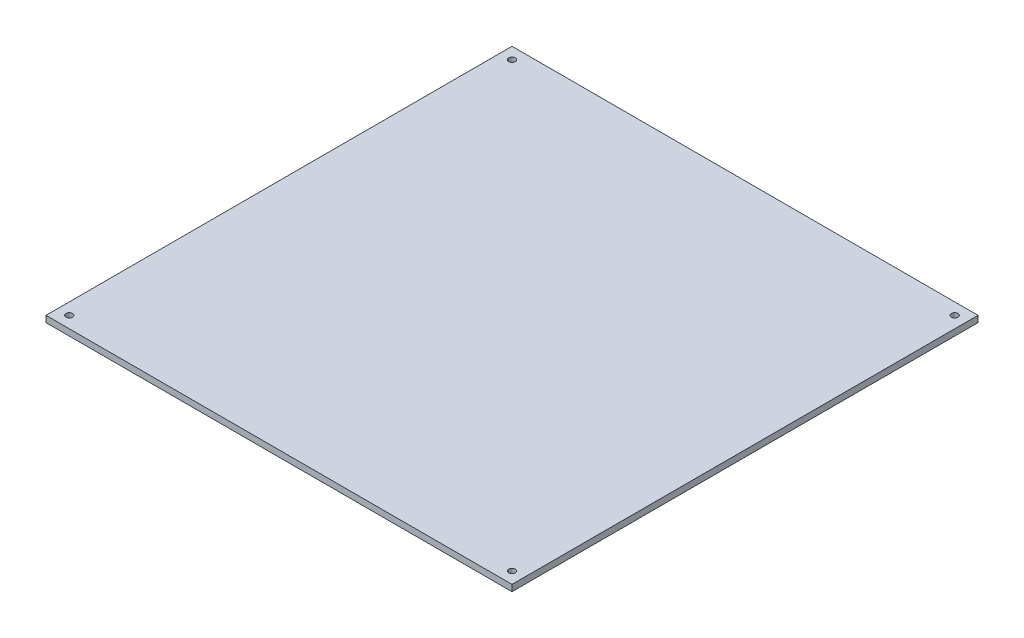
ISO-10303-21;
HEADER;
FILE_DESCRIPTION(('STEP AP214'),'2;1');
FILE_NAME('part.step','',(''),(''),'','','');
FILE_SCHEMA(('AUTOMOTIVE_DESIGN { 1 0 10303 214 1 1 1 1 }'));
ENDSEC;
DATA;
#1=APPLICATION_CONTEXT('core data for automotive mechanical design processes');
#2=APPLICATION_PROTOCOL_DEFINITION('international standard','automotive_design',2000,#1);
#3=PRODUCT_CONTEXT('',#1,'mechanical');
#4=PRODUCT('Part','Part','',(#3));
#5=PRODUCT_RELATED_PRODUCT_CATEGORY('part','',(#4));
#6=PRODUCT_DEFINITION_FORMATION('','',#4);
#7=PRODUCT_DEFINITION_CONTEXT('part definition',#1,'design');
#8=PRODUCT_DEFINITION('design','',#6,#7);
#9=PRODUCT_DEFINITION_SHAPE('','',#8);
#10=(LENGTH_UNIT() NAMED_UNIT(*) SI_UNIT(.MILLI.,.METRE.));
#11=(NAMED_UNIT(*) PLANE_ANGLE_UNIT() SI_UNIT($,.RADIAN.));
#12=(NAMED_UNIT(*) SI_UNIT($,.STERADIAN.) SOLID_ANGLE_UNIT());
#13=UNCERTAINTY_MEASURE_WITH_UNIT(LENGTH_MEASURE(1.E-05),#10,'distance_accuracy_value','');
#14=(GEOMETRIC_REPRESENTATION_CONTEXT(3) GLOBAL_UNCERTAINTY_ASSIGNED_CONTEXT((#13)) GLOBAL_UNIT_ASSIGNED_CONTEXT((#10,
#11,#12)) REPRESENTATION_CONTEXT('',''));
#15=CARTESIAN_POINT('',(0.,0.,0.));
#16=DIRECTION('',(0.,0.,1.));
#17=DIRECTION('',(1.,0.,0.));
#18=AXIS2_PLACEMENT_3D('',#15,#16,#17);
#19=CARTESIAN_POINT('',(0.,3.,0.));
#20=DIRECTION('',(0.,-1.,0.));
#21=DIRECTION('',(0.,0.,-1.));
#22=AXIS2_PLACEMENT_3D('',#19,#20,#21);
#23=PLANE('',#22);
#24=DIRECTION('',(0.,0.,1.));
#25=VECTOR('',#24,1.);
#26=CARTESIAN_POINT('',(0.,3.,0.));
#27=LINE('',#26,#25);
#28=CARTESIAN_POINT('',(0.,3.,-220.));
#29=VERTEX_POINT('',#28);
#30=CARTESIAN_POINT('',(0.,3.,0.));
#31=VERTEX_POINT('',#30);
#32=EDGE_CURVE('E85',#29,#31,#27,.T.);
#33=ORIENTED_EDGE('',*,*,#32,.T.);
#34=DIRECTION('',(1.,0.,0.));
#35=VECTOR('',#34,1.);
#36=CARTESIAN_POINT('',(0.,3.,0.));
#37=LINE('',#36,#35);
#38=CARTESIAN_POINT('',(220.,3.,0.));
#39=VERTEX_POINT('',#38);
#40=EDGE_CURVE('E80',#31,#39,#37,.T.);
#41=ORIENTED_EDGE('',*,*,#40,.T.);
#42=DIRECTION('',(0.,0.,-1.));
#43=VECTOR('',#42,1.);
#44=CARTESIAN_POINT('',(220.,3.,0.));
#45=LINE('',#44,#43);
#46=CARTESIAN_POINT('',(220.,3.,-220.));
#47=VERTEX_POINT('',#46);
#48=EDGE_CURVE('E83',#39,#47,#45,.T.);
#49=ORIENTED_EDGE('',*,*,#48,.T.);
#50=DIRECTION('',(-1.,0.,0.));
#51=VECTOR('',#50,1.);
#52=CARTESIAN_POINT('',(0.,3.,-220.));
#53=LINE('',#52,#51);
#54=EDGE_CURVE('E50',#47,#29,#53,.T.);
#55=ORIENTED_EDGE('',*,*,#54,.T.);
#56=EDGE_LOOP('',(#33,#41,#49,#55));
#57=FACE_BOUND('',#56,.T.);
#58=CARTESIAN_POINT('',(5.50000000000001,3.,-214.5));
#59=DIRECTION('',(0.,1.,0.));
#60=DIRECTION('',(0.,0.,1.));
#61=AXIS2_PLACEMENT_3D('',#58,#59,#60);
#62=CIRCLE('',#61,1.55);
#63=CARTESIAN_POINT('',(5.50000000000001,3.,-212.95));
#64=VERTEX_POINT('',#63);
#65=EDGE_CURVE('E100',#64,#64,#62,.T.);
#66=ORIENTED_EDGE('',*,*,#65,.F.);
#67=EDGE_LOOP('',(#66));
#68=FACE_BOUND('',#67,.T.);
#69=CARTESIAN_POINT('',(5.50000000000001,3.,-5.49999999999999));
#70=DIRECTION('',(0.,1.,0.));
#71=DIRECTION('',(0.,0.,1.));
#72=AXIS2_PLACEMENT_3D('',#69,#70,#71);
#73=CIRCLE('',#72,1.55);
#74=CARTESIAN_POINT('',(5.50000000000001,3.,-3.94999999999999));
#75=VERTEX_POINT('',#74);
#76=EDGE_CURVE('E115',#75,#75,#73,.T.);
#77=ORIENTED_EDGE('',*,*,#76,.F.);
#78=EDGE_LOOP('',(#77));
#79=FACE_BOUND('',#78,.T.);
#80=CARTESIAN_POINT('',(214.5,3.,-5.49999999999999));
#81=DIRECTION('',(0.,1.,0.));
#82=DIRECTION('',(0.,0.,1.));
#83=AXIS2_PLACEMENT_3D('',#80,#81,#82);
#84=CIRCLE('',#83,1.54999999999996);
#85=CARTESIAN_POINT('',(214.5,3.,-3.95000000000003));
#86=VERTEX_POINT('',#85);
#87=EDGE_CURVE('E121',#86,#86,#84,.T.);
#88=ORIENTED_EDGE('',*,*,#87,.F.);
#89=EDGE_LOOP('',(#88));
#90=FACE_BOUND('',#89,.T.);
#91=CARTESIAN_POINT('',(214.5,3.,-214.5));
#92=DIRECTION('',(0.,1.,0.));
#93=DIRECTION('',(0.,0.,1.));
#94=AXIS2_PLACEMENT_3D('',#91,#92,#93);
#95=CIRCLE('',#94,1.54999999999997);
#96=CARTESIAN_POINT('',(214.5,3.,-212.95));
#97=VERTEX_POINT('',#96);
#98=EDGE_CURVE('E127',#97,#97,#95,.T.);
#99=ORIENTED_EDGE('',*,*,#98,.F.);
#100=EDGE_LOOP('',(#99));
#101=FACE_BOUND('',#100,.T.);
#102=ADVANCED_FACE('F33',(#57,#68,#79,#90,#101),#23,.F.);
#103=CARTESIAN_POINT('',(0.,0.,0.));
#104=DIRECTION('',(0.,-1.,0.));
#105=DIRECTION('',(0.,0.,-1.));
#106=AXIS2_PLACEMENT_3D('',#103,#104,#105);
#107=PLANE('',#106);
#108=CARTESIAN_POINT('',(214.5,0.,-5.49999999999999));
#109=DIRECTION('',(0.,1.,0.));
#110=DIRECTION('',(0.,0.,1.));
#111=AXIS2_PLACEMENT_3D('',#108,#109,#110);
#112=CIRCLE('',#111,1.54999999999996);
#113=CARTESIAN_POINT('',(214.5,0.,-3.95000000000003));
#114=VERTEX_POINT('',#113);
#115=EDGE_CURVE('E124',#114,#114,#112,.T.);
#116=ORIENTED_EDGE('',*,*,#115,.T.);
#117=EDGE_LOOP('',(#116));
#118=FACE_BOUND('',#117,.T.);
#119=CARTESIAN_POINT('',(5.50000000000001,0.,-214.5));
#120=DIRECTION('',(0.,1.,0.));
#121=DIRECTION('',(0.,0.,1.));
#122=AXIS2_PLACEMENT_3D('',#119,#120,#121);
#123=CIRCLE('',#122,1.55);
#124=CARTESIAN_POINT('',(5.50000000000001,0.,-212.95));
#125=VERTEX_POINT('',#124);
#126=EDGE_CURVE('E112',#125,#125,#123,.T.);
#127=ORIENTED_EDGE('',*,*,#126,.T.);
#128=EDGE_LOOP('',(#127));
#129=FACE_BOUND('',#128,.T.);
#130=DIRECTION('',(0.,0.,1.));
#131=VECTOR('',#130,1.);
#132=CARTESIAN_POINT('',(0.,0.,0.));
#133=LINE('',#132,#131);
#134=CARTESIAN_POINT('',(0.,0.,-220.));
#135=VERTEX_POINT('',#134);
#136=CARTESIAN_POINT('',(0.,0.,0.));
#137=VERTEX_POINT('',#136);
#138=EDGE_CURVE('E97',#135,#137,#133,.T.);
#139=ORIENTED_EDGE('',*,*,#138,.F.);
#140=DIRECTION('',(-1.,0.,0.));
#141=VECTOR('',#140,1.);
#142=CARTESIAN_POINT('',(0.,0.,-220.));
#143=LINE('',#142,#141);
#144=CARTESIAN_POINT('',(220.,0.,-220.));
#145=VERTEX_POINT('',#144);
#146=EDGE_CURVE('E73',#145,#135,#143,.T.);
#147=ORIENTED_EDGE('',*,*,#146,.F.);
#148=DIRECTION('',(0.,0.,-1.));
#149=VECTOR('',#148,1.);
#150=CARTESIAN_POINT('',(220.,0.,0.));
#151=LINE('',#150,#149);
#152=CARTESIAN_POINT('',(220.,0.,0.));
#153=VERTEX_POINT('',#152);
#154=EDGE_CURVE('E67',#153,#145,#151,.T.);
#155=ORIENTED_EDGE('',*,*,#154,.F.);
#156=DIRECTION('',(1.,0.,0.));
#157=VECTOR('',#156,1.);
#158=CARTESIAN_POINT('',(0.,0.,0.));
#159=LINE('',#158,#157);
#160=EDGE_CURVE('E89',#137,#153,#159,.T.);
#161=ORIENTED_EDGE('',*,*,#160,.F.);
#162=EDGE_LOOP('',(#139,#147,#155,#161));
#163=FACE_BOUND('',#162,.T.);
#164=CARTESIAN_POINT('',(5.50000000000001,0.,-5.49999999999999));
#165=DIRECTION('',(0.,1.,0.));
#166=DIRECTION('',(0.,0.,1.));
#167=AXIS2_PLACEMENT_3D('',#164,#165,#166);
#168=CIRCLE('',#167,1.55);
#169=CARTESIAN_POINT('',(5.50000000000001,0.,-3.94999999999999));
#170=VERTEX_POINT('',#169);
#171=EDGE_CURVE('E118',#170,#170,#168,.T.);
#172=ORIENTED_EDGE('',*,*,#171,.T.);
#173=EDGE_LOOP('',(#172));
#174=FACE_BOUND('',#173,.T.);
#175=CARTESIAN_POINT('',(214.5,0.,-214.5));
#176=DIRECTION('',(0.,1.,0.));
#177=DIRECTION('',(0.,0.,1.));
#178=AXIS2_PLACEMENT_3D('',#175,#176,#177);
#179=CIRCLE('',#178,1.54999999999997);
#180=CARTESIAN_POINT('',(214.5,0.,-212.95));
#181=VERTEX_POINT('',#180);
#182=EDGE_CURVE('E130',#181,#181,#179,.T.);
#183=ORIENTED_EDGE('',*,*,#182,.T.);
#184=EDGE_LOOP('',(#183));
#185=FACE_BOUND('',#184,.T.);
#186=ADVANCED_FACE('F108',(#118,#129,#163,#174,#185),#107,.T.);
#187=CARTESIAN_POINT('',(0.,3.,0.));
#188=DIRECTION('',(1.,0.,0.));
#189=DIRECTION('',(0.,0.,-1.));
#190=AXIS2_PLACEMENT_3D('',#187,#188,#189);
#191=PLANE('',#190);
#192=ORIENTED_EDGE('',*,*,#138,.T.);
#193=DIRECTION('',(0.,-1.,0.));
#194=VECTOR('',#193,1.);
#195=CARTESIAN_POINT('',(0.,3.,0.));
#196=LINE('',#195,#194);
#197=EDGE_CURVE('E11',#31,#137,#196,.T.);
#198=ORIENTED_EDGE('',*,*,#197,.F.);
#199=ORIENTED_EDGE('',*,*,#32,.F.);
#200=DIRECTION('',(0.,-1.,0.));
#201=VECTOR('',#200,1.);
#202=CARTESIAN_POINT('',(0.,3.,-220.));
#203=LINE('',#202,#201);
#204=EDGE_CURVE('E93',#29,#135,#203,.T.);
#205=ORIENTED_EDGE('',*,*,#204,.T.);
#206=EDGE_LOOP('',(#192,#198,#199,#205));
#207=FACE_BOUND('',#206,.T.);
#208=ADVANCED_FACE('F35',(#207),#191,.F.);
#209=CARTESIAN_POINT('',(0.,3.,0.));
#210=DIRECTION('',(0.,0.,-1.));
#211=DIRECTION('',(-1.,0.,0.));
#212=AXIS2_PLACEMENT_3D('',#209,#210,#211);
#213=PLANE('',#212);
#214=ORIENTED_EDGE('',*,*,#160,.T.);
#215=DIRECTION('',(0.,-1.,0.));
#216=VECTOR('',#215,1.);
#217=CARTESIAN_POINT('',(220.,3.,0.));
#218=LINE('',#217,#216);
#219=EDGE_CURVE('E42',#39,#153,#218,.T.);
#220=ORIENTED_EDGE('',*,*,#219,.F.);
#221=ORIENTED_EDGE('',*,*,#40,.F.);
#222=ORIENTED_EDGE('',*,*,#197,.T.);
#223=EDGE_LOOP('',(#214,#220,#221,#222));
#224=FACE_BOUND('',#223,.T.);
#225=ADVANCED_FACE('F88',(#224),#213,.F.);
#226=CARTESIAN_POINT('',(220.,3.,0.));
#227=DIRECTION('',(-1.,0.,0.));
#228=DIRECTION('',(0.,0.,1.));
#229=AXIS2_PLACEMENT_3D('',#226,#227,#228);
#230=PLANE('',#229);
#231=ORIENTED_EDGE('',*,*,#154,.T.);
#232=DIRECTION('',(0.,-1.,0.));
#233=VECTOR('',#232,1.);
#234=CARTESIAN_POINT('',(220.,3.,-220.));
#235=LINE('',#234,#233);
#236=EDGE_CURVE('E90',#47,#145,#235,.T.);
#237=ORIENTED_EDGE('',*,*,#236,.F.);
#238=ORIENTED_EDGE('',*,*,#48,.F.);
#239=ORIENTED_EDGE('',*,*,#219,.T.);
#240=EDGE_LOOP('',(#231,#237,#238,#239));
#241=FACE_BOUND('',#240,.T.);
#242=ADVANCED_FACE('F91',(#241),#230,.F.);
#243=CARTESIAN_POINT('',(0.,3.,-220.));
#244=DIRECTION('',(0.,0.,1.));
#245=DIRECTION('',(1.,0.,0.));
#246=AXIS2_PLACEMENT_3D('',#243,#244,#245);
#247=PLANE('',#246);
#248=ORIENTED_EDGE('',*,*,#146,.T.);
#249=ORIENTED_EDGE('',*,*,#204,.F.);
#250=ORIENTED_EDGE('',*,*,#54,.F.);
#251=ORIENTED_EDGE('',*,*,#236,.T.);
#252=EDGE_LOOP('',(#248,#249,#250,#251));
#253=FACE_BOUND('',#252,.T.);
#254=ADVANCED_FACE('F105',(#253),#247,.F.);
#255=CARTESIAN_POINT('',(5.50000000000001,3.,-214.5));
#256=DIRECTION('',(0.,-1.,0.));
#257=DIRECTION('',(0.,0.,-1.));
#258=AXIS2_PLACEMENT_3D('',#255,#256,#257);
#259=CYLINDRICAL_SURFACE('',#258,1.55);
#260=ORIENTED_EDGE('',*,*,#65,.T.);
#261=EDGE_LOOP('',(#260));
#262=FACE_BOUND('',#261,.T.);
#263=ORIENTED_EDGE('',*,*,#126,.F.);
#264=EDGE_LOOP('',(#263));
#265=FACE_BOUND('',#264,.T.);
#266=ADVANCED_FACE('F147',(#262,#265),#259,.F.);
#267=CARTESIAN_POINT('',(5.50000000000001,3.,-5.49999999999999));
#268=DIRECTION('',(0.,-1.,0.));
#269=DIRECTION('',(0.,0.,-1.));
#270=AXIS2_PLACEMENT_3D('',#267,#268,#269);
#271=CYLINDRICAL_SURFACE('',#270,1.55);
#272=ORIENTED_EDGE('',*,*,#76,.T.);
#273=EDGE_LOOP('',(#272));
#274=FACE_BOUND('',#273,.T.);
#275=ORIENTED_EDGE('',*,*,#171,.F.);
#276=EDGE_LOOP('',(#275));
#277=FACE_BOUND('',#276,.T.);
#278=ADVANCED_FACE('F193',(#274,#277),#271,.F.);
#279=CARTESIAN_POINT('',(214.5,3.,-5.49999999999999));
#280=DIRECTION('',(0.,-1.,0.));
#281=DIRECTION('',(0.,0.,-1.));
#282=AXIS2_PLACEMENT_3D('',#279,#280,#281);
#283=CYLINDRICAL_SURFACE('',#282,1.54999999999996);
#284=ORIENTED_EDGE('',*,*,#87,.T.);
#285=EDGE_LOOP('',(#284));
#286=FACE_BOUND('',#285,.T.);
#287=ORIENTED_EDGE('',*,*,#115,.F.);
#288=EDGE_LOOP('',(#287));
#289=FACE_BOUND('',#288,.T.);
#290=ADVANCED_FACE('F201',(#286,#289),#283,.F.);
#291=CARTESIAN_POINT('',(214.5,3.,-214.5));
#292=DIRECTION('',(0.,-1.,0.));
#293=DIRECTION('',(0.,0.,-1.));
#294=AXIS2_PLACEMENT_3D('',#291,#292,#293);
#295=CYLINDRICAL_SURFACE('',#294,1.54999999999997);
#296=ORIENTED_EDGE('',*,*,#98,.T.);
#297=EDGE_LOOP('',(#296));
#298=FACE_BOUND('',#297,.T.);
#299=ORIENTED_EDGE('',*,*,#182,.F.);
#300=EDGE_LOOP('',(#299));
#301=FACE_BOUND('',#300,.T.);
#302=ADVANCED_FACE('F136',(#298,#301),#295,.F.);
#303=CLOSED_SHELL('',(#102,#186,#208,#225,#242,#254,#266,#278,#290,#302));
#304=MANIFOLD_SOLID_BREP('B2',#303);
#305=ADVANCED_BREP_SHAPE_REPRESENTATION('',(#18,#304),#14);
#306=SHAPE_DEFINITION_REPRESENTATION(#9,#305);
ENDSEC;
END-ISO-10303-21;
